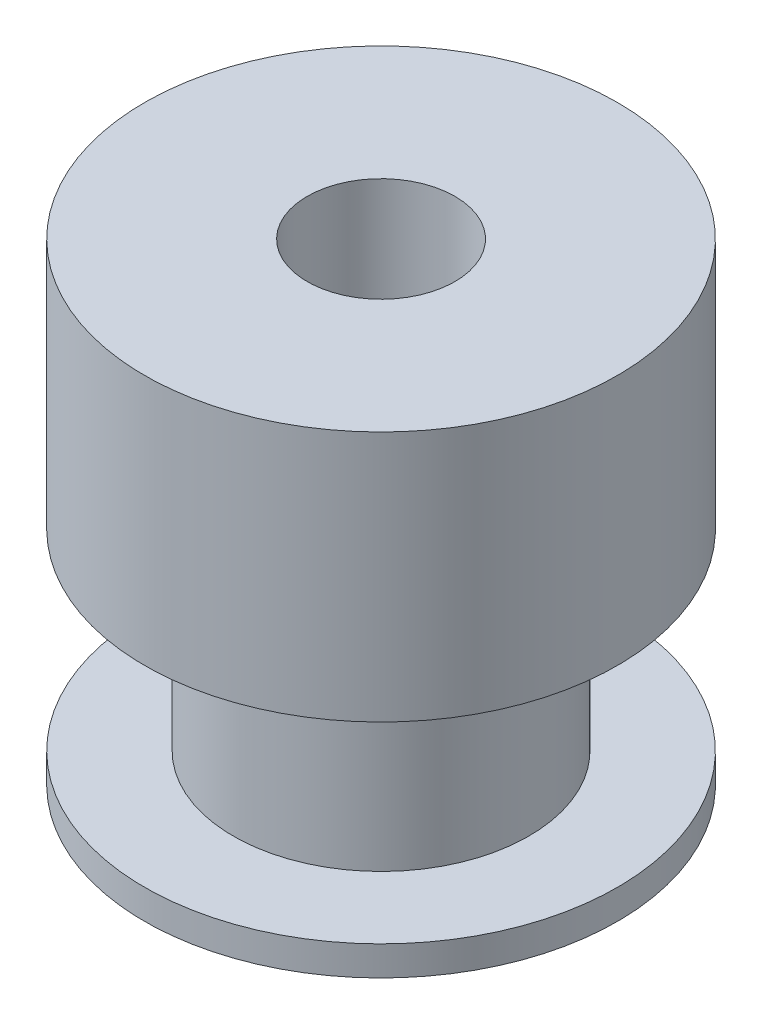
ISO-10303-21;
HEADER;
FILE_DESCRIPTION(('STEP AP214'),'2;1');
FILE_NAME('part.step','',(''),(''),'','','');
FILE_SCHEMA(('AUTOMOTIVE_DESIGN { 1 0 10303 214 1 1 1 1 }'));
ENDSEC;
DATA;
#1=APPLICATION_CONTEXT('core data for automotive mechanical design processes');
#2=APPLICATION_PROTOCOL_DEFINITION('international standard','automotive_design',2000,#1);
#3=PRODUCT_CONTEXT('',#1,'mechanical');
#4=PRODUCT('Part','Part','',(#3));
#5=PRODUCT_RELATED_PRODUCT_CATEGORY('part','',(#4));
#6=PRODUCT_DEFINITION_FORMATION('','',#4);
#7=PRODUCT_DEFINITION_CONTEXT('part definition',#1,'design');
#8=PRODUCT_DEFINITION('design','',#6,#7);
#9=PRODUCT_DEFINITION_SHAPE('','',#8);
#10=(LENGTH_UNIT() NAMED_UNIT(*) SI_UNIT(.MILLI.,.METRE.));
#11=(NAMED_UNIT(*) PLANE_ANGLE_UNIT() SI_UNIT($,.RADIAN.));
#12=(NAMED_UNIT(*) SI_UNIT($,.STERADIAN.) SOLID_ANGLE_UNIT());
#13=UNCERTAINTY_MEASURE_WITH_UNIT(LENGTH_MEASURE(1.E-05),#10,'distance_accuracy_value','');
#14=(GEOMETRIC_REPRESENTATION_CONTEXT(3) GLOBAL_UNCERTAINTY_ASSIGNED_CONTEXT((#13)) GLOBAL_UNIT_ASSIGNED_CONTEXT((#10,
#11,#12)) REPRESENTATION_CONTEXT('',''));
#15=CARTESIAN_POINT('',(0.,0.,0.));
#16=DIRECTION('',(0.,0.,1.));
#17=DIRECTION('',(1.,0.,0.));
#18=AXIS2_PLACEMENT_3D('',#15,#16,#17);
#19=CARTESIAN_POINT('',(8.,-8.,0.));
#20=DIRECTION('',(0.,-1.,0.));
#21=DIRECTION('',(0.,0.,-1.));
#22=AXIS2_PLACEMENT_3D('',#19,#20,#21);
#23=PLANE('',#22);
#24=CARTESIAN_POINT('',(0.,-8.,0.));
#25=DIRECTION('',(0.,-1.,0.));
#26=DIRECTION('',(0.,0.,-1.));
#27=AXIS2_PLACEMENT_3D('',#24,#25,#26);
#28=CIRCLE('',#27,8.);
#29=CARTESIAN_POINT('',(0.,-8.,-8.));
#30=VERTEX_POINT('',#29);
#31=EDGE_CURVE('E72',#30,#30,#28,.T.);
#32=ORIENTED_EDGE('',*,*,#31,.T.);
#33=EDGE_LOOP('',(#32));
#34=FACE_BOUND('',#33,.T.);
#35=CARTESIAN_POINT('',(0.,-8.,0.));
#36=DIRECTION('',(0.,-1.,0.));
#37=DIRECTION('',(0.,0.,-1.));
#38=AXIS2_PLACEMENT_3D('',#35,#36,#37);
#39=CIRCLE('',#38,2.5);
#40=CARTESIAN_POINT('',(0.,-8.,-2.5));
#41=VERTEX_POINT('',#40);
#42=EDGE_CURVE('E10',#41,#41,#39,.T.);
#43=ORIENTED_EDGE('',*,*,#42,.F.);
#44=EDGE_LOOP('',(#43));
#45=FACE_BOUND('',#44,.T.);
#46=ADVANCED_FACE('F37',(#34,#45),#23,.T.);
#47=CARTESIAN_POINT('',(0.,-4.88152890571142,0.));
#48=DIRECTION('',(0.,-1.,0.));
#49=DIRECTION('',(0.,0.,-1.));
#50=AXIS2_PLACEMENT_3D('',#47,#48,#49);
#51=CYLINDRICAL_SURFACE('',#50,2.5);
#52=ORIENTED_EDGE('',*,*,#42,.T.);
#53=EDGE_LOOP('',(#52));
#54=FACE_BOUND('',#53,.T.);
#55=CARTESIAN_POINT('',(0.,8.,0.));
#56=DIRECTION('',(0.,-1.,0.));
#57=DIRECTION('',(0.,0.,-1.));
#58=AXIS2_PLACEMENT_3D('',#55,#56,#57);
#59=CIRCLE('',#58,2.5);
#60=CARTESIAN_POINT('',(0.,8.,-2.5));
#61=VERTEX_POINT('',#60);
#62=EDGE_CURVE('E44',#61,#61,#59,.T.);
#63=ORIENTED_EDGE('',*,*,#62,.F.);
#64=EDGE_LOOP('',(#63));
#65=FACE_BOUND('',#64,.T.);
#66=ADVANCED_FACE('F91',(#54,#65),#51,.F.);
#67=CARTESIAN_POINT('',(2.5,8.,0.));
#68=DIRECTION('',(0.,1.,0.));
#69=DIRECTION('',(0.,0.,1.));
#70=AXIS2_PLACEMENT_3D('',#67,#68,#69);
#71=PLANE('',#70);
#72=ORIENTED_EDGE('',*,*,#62,.T.);
#73=EDGE_LOOP('',(#72));
#74=FACE_BOUND('',#73,.T.);
#75=CARTESIAN_POINT('',(0.,8.,0.));
#76=DIRECTION('',(0.,-1.,0.));
#77=DIRECTION('',(0.,0.,-1.));
#78=AXIS2_PLACEMENT_3D('',#75,#76,#77);
#79=CIRCLE('',#78,8.);
#80=CARTESIAN_POINT('',(0.,8.,-8.));
#81=VERTEX_POINT('',#80);
#82=EDGE_CURVE('E49',#81,#81,#79,.T.);
#83=ORIENTED_EDGE('',*,*,#82,.F.);
#84=EDGE_LOOP('',(#83));
#85=FACE_BOUND('',#84,.T.);
#86=ADVANCED_FACE('F95',(#74,#85),#71,.T.);
#87=CARTESIAN_POINT('',(0.,-4.88152890571142,0.));
#88=DIRECTION('',(0.,-1.,0.));
#89=DIRECTION('',(0.,0.,-1.));
#90=AXIS2_PLACEMENT_3D('',#87,#88,#89);
#91=CYLINDRICAL_SURFACE('',#90,8.);
#92=ORIENTED_EDGE('',*,*,#82,.T.);
#93=EDGE_LOOP('',(#92));
#94=FACE_BOUND('',#93,.T.);
#95=CARTESIAN_POINT('',(0.,-0.499999999999999,0.));
#96=DIRECTION('',(0.,-1.,0.));
#97=DIRECTION('',(0.,0.,-1.));
#98=AXIS2_PLACEMENT_3D('',#95,#96,#97);
#99=CIRCLE('',#98,8.);
#100=CARTESIAN_POINT('',(0.,-0.499999999999999,-8.));
#101=VERTEX_POINT('',#100);
#102=EDGE_CURVE('E54',#101,#101,#99,.T.);
#103=ORIENTED_EDGE('',*,*,#102,.F.);
#104=EDGE_LOOP('',(#103));
#105=FACE_BOUND('',#104,.T.);
#106=ADVANCED_FACE('F99',(#94,#105),#91,.T.);
#107=CARTESIAN_POINT('',(8.,-0.499999999999999,0.));
#108=DIRECTION('',(0.,-1.,0.));
#109=DIRECTION('',(0.,0.,-1.));
#110=AXIS2_PLACEMENT_3D('',#107,#108,#109);
#111=PLANE('',#110);
#112=ORIENTED_EDGE('',*,*,#102,.T.);
#113=EDGE_LOOP('',(#112));
#114=FACE_BOUND('',#113,.T.);
#115=CARTESIAN_POINT('',(0.,-0.5,0.));
#116=DIRECTION('',(0.,-1.,0.));
#117=DIRECTION('',(0.,0.,-1.));
#118=AXIS2_PLACEMENT_3D('',#115,#116,#117);
#119=CIRCLE('',#118,5.);
#120=CARTESIAN_POINT('',(0.,-0.5,-5.));
#121=VERTEX_POINT('',#120);
#122=EDGE_CURVE('E60',#121,#121,#119,.T.);
#123=ORIENTED_EDGE('',*,*,#122,.F.);
#124=EDGE_LOOP('',(#123));
#125=FACE_BOUND('',#124,.T.);
#126=ADVANCED_FACE('F105',(#114,#125),#111,.T.);
#127=CARTESIAN_POINT('',(0.,-4.88152890571142,0.));
#128=DIRECTION('',(0.,-1.,0.));
#129=DIRECTION('',(0.,0.,-1.));
#130=AXIS2_PLACEMENT_3D('',#127,#128,#129);
#131=CYLINDRICAL_SURFACE('',#130,5.);
#132=ORIENTED_EDGE('',*,*,#122,.T.);
#133=EDGE_LOOP('',(#132));
#134=FACE_BOUND('',#133,.T.);
#135=CARTESIAN_POINT('',(0.,-7.,0.));
#136=DIRECTION('',(0.,-1.,0.));
#137=DIRECTION('',(0.,0.,-1.));
#138=AXIS2_PLACEMENT_3D('',#135,#136,#137);
#139=CIRCLE('',#138,5.);
#140=CARTESIAN_POINT('',(0.,-7.,-5.));
#141=VERTEX_POINT('',#140);
#142=EDGE_CURVE('E64',#141,#141,#139,.T.);
#143=ORIENTED_EDGE('',*,*,#142,.F.);
#144=EDGE_LOOP('',(#143));
#145=FACE_BOUND('',#144,.T.);
#146=ADVANCED_FACE('F87',(#134,#145),#131,.T.);
#147=CARTESIAN_POINT('',(5.,-7.,0.));
#148=DIRECTION('',(0.,1.,0.));
#149=DIRECTION('',(0.,0.,1.));
#150=AXIS2_PLACEMENT_3D('',#147,#148,#149);
#151=PLANE('',#150);
#152=ORIENTED_EDGE('',*,*,#142,.T.);
#153=EDGE_LOOP('',(#152));
#154=FACE_BOUND('',#153,.T.);
#155=CARTESIAN_POINT('',(0.,-7.,0.));
#156=DIRECTION('',(0.,-1.,0.));
#157=DIRECTION('',(0.,0.,-1.));
#158=AXIS2_PLACEMENT_3D('',#155,#156,#157);
#159=CIRCLE('',#158,8.);
#160=CARTESIAN_POINT('',(0.,-7.,-8.));
#161=VERTEX_POINT('',#160);
#162=EDGE_CURVE('E68',#161,#161,#159,.T.);
#163=ORIENTED_EDGE('',*,*,#162,.F.);
#164=EDGE_LOOP('',(#163));
#165=FACE_BOUND('',#164,.T.);
#166=ADVANCED_FACE('F81',(#154,#165),#151,.T.);
#167=CARTESIAN_POINT('',(0.,-4.88152890571142,0.));
#168=DIRECTION('',(0.,-1.,0.));
#169=DIRECTION('',(0.,0.,-1.));
#170=AXIS2_PLACEMENT_3D('',#167,#168,#169);
#171=CYLINDRICAL_SURFACE('',#170,8.);
#172=ORIENTED_EDGE('',*,*,#162,.T.);
#173=EDGE_LOOP('',(#172));
#174=FACE_BOUND('',#173,.T.);
#175=ORIENTED_EDGE('',*,*,#31,.F.);
#176=EDGE_LOOP('',(#175));
#177=FACE_BOUND('',#176,.T.);
#178=ADVANCED_FACE('F79',(#174,#177),#171,.T.);
#179=CLOSED_SHELL('',(#46,#66,#86,#106,#126,#146,#166,#178));
#180=MANIFOLD_SOLID_BREP('B2',#179);
#181=ADVANCED_BREP_SHAPE_REPRESENTATION('',(#18,#180),#14);
#182=SHAPE_DEFINITION_REPRESENTATION(#9,#181);
ENDSEC;
END-ISO-10303-21;
